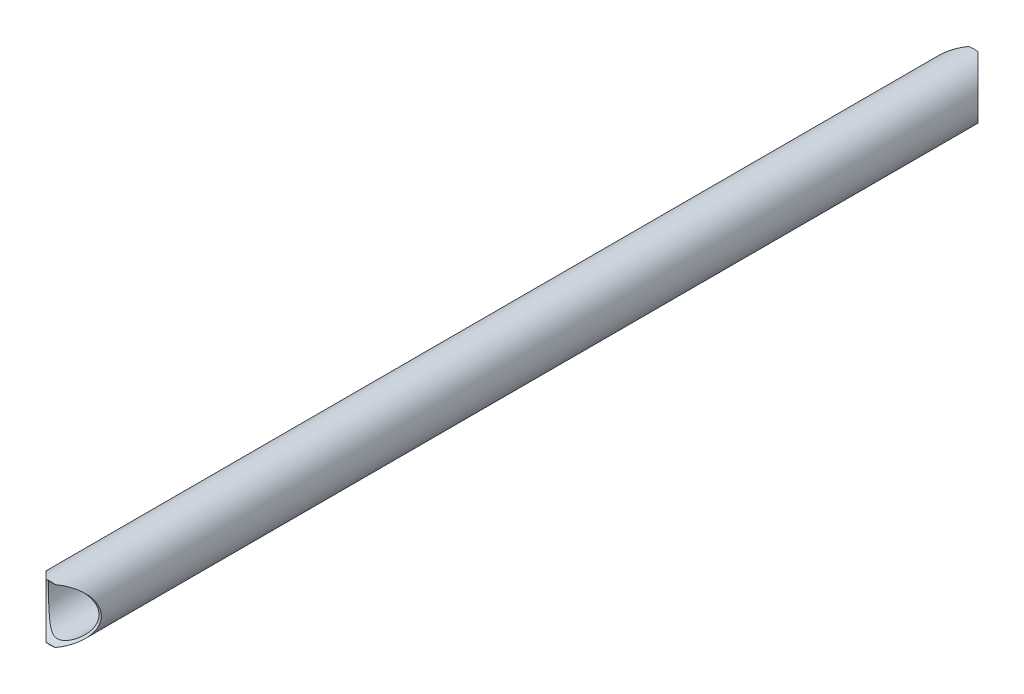
ISO-10303-21;
HEADER;
FILE_DESCRIPTION(('STEP AP214'),'2;1');
FILE_NAME('part.step','',(''),(''),'','','');
FILE_SCHEMA(('AUTOMOTIVE_DESIGN { 1 0 10303 214 1 1 1 1 }'));
ENDSEC;
DATA;
#1=APPLICATION_CONTEXT('core data for automotive mechanical design processes');
#2=APPLICATION_PROTOCOL_DEFINITION('international standard','automotive_design',2000,#1);
#3=PRODUCT_CONTEXT('',#1,'mechanical');
#4=PRODUCT('Part','Part','',(#3));
#5=PRODUCT_RELATED_PRODUCT_CATEGORY('part','',(#4));
#6=PRODUCT_DEFINITION_FORMATION('','',#4);
#7=PRODUCT_DEFINITION_CONTEXT('part definition',#1,'design');
#8=PRODUCT_DEFINITION('design','',#6,#7);
#9=PRODUCT_DEFINITION_SHAPE('','',#8);
#10=(LENGTH_UNIT() NAMED_UNIT(*) SI_UNIT(.MILLI.,.METRE.));
#11=(NAMED_UNIT(*) PLANE_ANGLE_UNIT() SI_UNIT($,.RADIAN.));
#12=(NAMED_UNIT(*) SI_UNIT($,.STERADIAN.) SOLID_ANGLE_UNIT());
#13=UNCERTAINTY_MEASURE_WITH_UNIT(LENGTH_MEASURE(1.E-05),#10,'distance_accuracy_value','');
#14=(GEOMETRIC_REPRESENTATION_CONTEXT(3) GLOBAL_UNCERTAINTY_ASSIGNED_CONTEXT((#13)) GLOBAL_UNIT_ASSIGNED_CONTEXT((#10,
#11,#12)) REPRESENTATION_CONTEXT('',''));
#15=CARTESIAN_POINT('',(0.,0.,0.));
#16=DIRECTION('',(0.,0.,1.));
#17=DIRECTION('',(1.,0.,0.));
#18=AXIS2_PLACEMENT_3D('',#15,#16,#17);
#19=CARTESIAN_POINT('',(-19.05,0.,320.675));
#20=DIRECTION('',(1.,0.,0.));
#21=DIRECTION('',(0.,1.,0.));
#22=AXIS2_PLACEMENT_3D('',#19,#20,#21);
#23=CYLINDRICAL_SURFACE('',#22,19.05);
#24=CARTESIAN_POINT('',(0.,0.,320.675));
#25=DIRECTION('',(-0.707106781186547,0.,-0.707106781186547));
#26=DIRECTION('',(0.707106781186547,0.,-0.707106781186547));
#27=AXIS2_PLACEMENT_3D('',#24,#25,#26);
#28=ELLIPSE('',#27,26.9407683632075,19.05);
#29=CARTESIAN_POINT('',(3.17500000000027,18.7835533113412,317.5));
#30=VERTEX_POINT('',#29);
#31=CARTESIAN_POINT('',(3.17499999999992,-18.7835533113413,317.5));
#32=VERTEX_POINT('',#31);
#33=EDGE_CURVE('E38',#30,#32,#28,.T.);
#34=ORIENTED_EDGE('',*,*,#33,.F.);
#35=DIRECTION('',(1.,0.,0.));
#36=VECTOR('',#35,1.);
#37=CARTESIAN_POINT('',(-19.05,18.7835533113412,317.5));
#38=LINE('',#37,#36);
#39=CARTESIAN_POINT('',(-3.17500000000027,18.7835533113412,317.5));
#40=VERTEX_POINT('',#39);
#41=EDGE_CURVE('E10',#30,#40,#38,.F.);
#42=ORIENTED_EDGE('',*,*,#41,.T.);
#43=CARTESIAN_POINT('',(0.,0.,320.675));
#44=DIRECTION('',(0.707106781186547,0.,-0.707106781186547));
#45=DIRECTION('',(-0.707106781186547,0.,-0.707106781186547));
#46=AXIS2_PLACEMENT_3D('',#43,#44,#45);
#47=ELLIPSE('',#46,26.9407683632075,19.05);
#48=CARTESIAN_POINT('',(-3.17499999999992,-18.7835533113413,317.5));
#49=VERTEX_POINT('',#48);
#50=EDGE_CURVE('E90',#49,#40,#47,.T.);
#51=ORIENTED_EDGE('',*,*,#50,.F.);
#52=DIRECTION('',(1.,0.,0.));
#53=VECTOR('',#52,1.);
#54=CARTESIAN_POINT('',(-19.05,-18.7835533113413,317.5));
#55=LINE('',#54,#53);
#56=EDGE_CURVE('E30',#49,#32,#55,.T.);
#57=ORIENTED_EDGE('',*,*,#56,.T.);
#58=EDGE_LOOP('',(#34,#42,#51,#57));
#59=FACE_BOUND('',#58,.T.);
#60=CARTESIAN_POINT('',(17.399,0.,301.625));
#61=CARTESIAN_POINT('',(17.3989972637382,-0.401295477984503,301.625002701248));
#62=CARTESIAN_POINT('',(17.3850899575458,-0.802632767990221,301.637707080443));
#63=CARTESIAN_POINT('',(17.3297391071603,-1.60183121099222,301.688240623773));
#64=CARTESIAN_POINT('',(17.2882916644051,-1.99969186375831,301.726073345058));
#65=CARTESIAN_POINT('',(17.178656626257,-2.78886528874722,301.826046813985));
#66=CARTESIAN_POINT('',(17.110451424828,-3.18017357253039,301.888203566256));
#67=CARTESIAN_POINT('',(16.9485880673674,-3.95303278006495,302.035503976022));
#68=CARTESIAN_POINT('',(16.8549302041324,-4.33458381600433,302.120647369089));
#69=CARTESIAN_POINT('',(16.6444558992286,-5.08305605708649,302.311632424915));
#70=CARTESIAN_POINT('',(16.5277936695605,-5.45005612613705,302.417336198326));
#71=CARTESIAN_POINT('',(16.2726933574343,-6.17013555865848,302.647940498223));
#72=CARTESIAN_POINT('',(16.134255675443,-6.52321517798751,302.772840671673));
#73=CARTESIAN_POINT('',(15.837389979888,-7.21413093026866,303.039920803895));
#74=CARTESIAN_POINT('',(15.678958985095,-7.55196477968367,303.182103339547));
#75=CARTESIAN_POINT('',(15.3438713660465,-8.2114359013271,303.481801478121));
#76=CARTESIAN_POINT('',(15.1672106171196,-8.53306948347153,303.639320550638));
#77=CARTESIAN_POINT('',(14.7232674090559,-9.28493575660449,304.033555305363));
#78=CARTESIAN_POINT('',(14.4480160824563,-9.70710539157039,304.276733564436));
#79=CARTESIAN_POINT('',(13.869048039859,-10.5177477259465,304.784486395236));
#80=CARTESIAN_POINT('',(13.565320816571,-10.9062078843183,305.0490688599));
#81=CARTESIAN_POINT('',(12.9320986728774,-11.6501119710639,305.595517360938));
#82=CARTESIAN_POINT('',(12.6025521651888,-12.0054865273236,305.877417743096));
#83=CARTESIAN_POINT('',(11.9208031163851,-12.6826857364728,306.453551427335));
#84=CARTESIAN_POINT('',(11.5686034526533,-13.0045146367459,306.747783161451));
#85=CARTESIAN_POINT('',(10.8344071773254,-13.6226529108423,307.351454438697));
#86=CARTESIAN_POINT('',(10.4518967336267,-13.9181594242172,307.661089620099));
#87=CARTESIAN_POINT('',(9.66550523059681,-14.4753423367401,308.283811329452));
#88=CARTESIAN_POINT('',(9.26161904507632,-14.7370105687342,308.596898670896));
#89=CARTESIAN_POINT('',(8.4328662580154,-15.226400353901,309.220060569678));
#90=CARTESIAN_POINT('',(8.00803949509313,-15.454183288145,309.530139599546));
#91=CARTESIAN_POINT('',(7.35336707132236,-15.7705990288144,309.987382291738));
#92=CARTESIAN_POINT('',(7.13227305295607,-15.8718474735204,310.138461148031));
#93=CARTESIAN_POINT('',(6.68382149463942,-16.0658471121592,310.436706372003));
#94=CARTESIAN_POINT('',(6.45646472528382,-16.1585993454799,310.583873216693));
#95=CARTESIAN_POINT('',(5.99922041560824,-16.3338110393034,310.870064937972));
#96=CARTESIAN_POINT('',(5.76945627318041,-16.4164283948192,311.009189766358));
#97=CARTESIAN_POINT('',(5.30288041036134,-16.5730269563605,311.280226935764));
#98=CARTESIAN_POINT('',(5.06607005042598,-16.6470098160954,311.4121406553));
#99=CARTESIAN_POINT('',(4.58466839086435,-16.785968686058,311.666407610603));
#100=CARTESIAN_POINT('',(4.34007592514624,-16.8509433385821,311.788759404));
#101=CARTESIAN_POINT('',(3.84274065668843,-16.9712729810074,312.020782128037));
#102=CARTESIAN_POINT('',(3.58999888903799,-17.0266291869405,312.13045466109));
#103=CARTESIAN_POINT('',(2.90505246494307,-17.1602817410485,312.400784537975));
#104=CARTESIAN_POINT('',(2.46490900989023,-17.2294715038076,312.547067929093));
#105=CARTESIAN_POINT('',(1.79005263644762,-17.3081528356867,312.71671698946));
#106=CARTESIAN_POINT('',(1.56293361527498,-17.3301849394945,312.764943326347));
#107=CARTESIAN_POINT('',(1.10475750135388,-17.3654088459161,312.842573644779));
#108=CARTESIAN_POINT('',(0.873700794529618,-17.378601509813,312.871979460115));
#109=CARTESIAN_POINT('',(0.407238503850324,-17.3958144257975,312.910426096306));
#110=CARTESIAN_POINT('',(0.171812501272492,-17.3997430488713,312.919263467224));
#111=CARTESIAN_POINT('',(-0.298823332550326,-17.3980251590004,312.915410956066));
#112=CARTESIAN_POINT('',(-0.534033165848992,-17.3923787379826,312.902721280663));
#113=CARTESIAN_POINT('',(-1.00239096479141,-17.3716861155403,312.856582942652));
#114=CARTESIAN_POINT('',(-1.23553434141883,-17.3566226413099,312.823096134581));
#115=CARTESIAN_POINT('',(-1.69754111223164,-17.3175445787324,312.737282982415));
#116=CARTESIAN_POINT('',(-1.92640360165006,-17.2935281201242,312.684952702033));
#117=CARTESIAN_POINT('',(-2.44901999823298,-17.2283705808462,312.545217014727));
#118=CARTESIAN_POINT('',(-2.74082875856405,-17.1842269052584,312.451964988895));
#119=CARTESIAN_POINT('',(-3.31413220550718,-17.0829330564108,312.243553687738));
#120=CARTESIAN_POINT('',(-3.59562200390613,-17.0257768090685,312.128384185782));
#121=CARTESIAN_POINT('',(-4.14927470548216,-16.8993964367356,311.881125036109));
#122=CARTESIAN_POINT('',(-4.42140547374324,-16.8301349050272,311.748983287982));
#123=CARTESIAN_POINT('',(-4.95622640328321,-16.6804727351764,311.472332930567));
#124=CARTESIAN_POINT('',(-5.21891246879396,-16.6000673360697,311.327819045705));
#125=CARTESIAN_POINT('',(-5.73166832235644,-16.4300038333165,311.032067609751));
#126=CARTESIAN_POINT('',(-5.98186862535174,-16.3405035401112,310.88096431014));
#127=CARTESIAN_POINT('',(-6.47450872253533,-16.1516411624736,310.572540203637));
#128=CARTESIAN_POINT('',(-6.7169496874412,-16.0522805751134,310.415220342772));
#129=CARTESIAN_POINT('',(-7.19491232211282,-15.8438147888671,310.096135254256));
#130=CARTESIAN_POINT('',(-7.43042833895094,-15.7347019073105,309.934366592625));
#131=CARTESIAN_POINT('',(-7.89480502896909,-15.5069053851449,309.608020658585));
#132=CARTESIAN_POINT('',(-8.12366495844912,-15.3882206806013,309.443443075566));
#133=CARTESIAN_POINT('',(-8.80137125156712,-15.0175471096,308.946987525092));
#134=CARTESIAN_POINT('',(-9.24076727341732,-14.7511914025384,308.61277953889));
#135=CARTESIAN_POINT('',(-10.0951353720985,-14.1801700068193,307.94636878471));
#136=CARTESIAN_POINT('',(-10.5101151582842,-13.8755165069111,307.614165413835));
#137=CARTESIAN_POINT('',(-11.3429584257905,-13.2048311270682,306.93535388567));
#138=CARTESIAN_POINT('',(-11.7590682813179,-12.8360228961387,306.589320070563));
#139=CARTESIAN_POINT('',(-12.5607248970245,-12.052698722243,305.913469728379));
#140=CARTESIAN_POINT('',(-12.9462628233913,-11.6381696502894,305.583657899049));
#141=CARTESIAN_POINT('',(-13.6816202767154,-10.7639876204656,304.948273476111));
#142=CARTESIAN_POINT('',(-14.0315468917035,-10.3044786247362,304.642628866403));
#143=CARTESIAN_POINT('',(-14.526249846972,-9.58115590788083,304.20736049272));
#144=CARTESIAN_POINT('',(-14.6860865147969,-9.33443220655046,304.066167143789));
#145=CARTESIAN_POINT('',(-14.995019216579,-8.82961928430966,303.792382701999));
#146=CARTESIAN_POINT('',(-15.1441130171221,-8.57152771791701,303.659793398467));
#147=CARTESIAN_POINT('',(-15.46765341721,-7.97617772813552,303.371273641479));
#148=CARTESIAN_POINT('',(-15.6387030256946,-7.6356882500325,303.218158847452));
#149=CARTESIAN_POINT('',(-15.9603997252317,-6.9381756632432,302.929391086361));
#150=CARTESIAN_POINT('',(-16.1110530829717,-6.58115767833976,302.793732756487));
#151=CARTESIAN_POINT('',(-16.3899122170257,-5.85218695501575,302.54207640953));
#152=CARTESIAN_POINT('',(-16.5181417196303,-5.48025052030166,302.426057616405));
#153=CARTESIAN_POINT('',(-16.7503954683688,-4.72294688996841,302.215567826417));
#154=CARTESIAN_POINT('',(-16.8544229930462,-4.33758152165401,302.12109391099));
#155=CARTESIAN_POINT('',(-17.019696834772,-3.62798609045296,301.970817854941));
#156=CARTESIAN_POINT('',(-17.0852949692311,-3.30559095195943,301.911096854446));
#157=CARTESIAN_POINT('',(-17.1983931013157,-2.65507480714684,301.808058566684));
#158=CARTESIAN_POINT('',(-17.2458956562491,-2.32695461676436,301.76473896154));
#159=CARTESIAN_POINT('',(-17.3221716737546,-1.66673103302197,301.69515052222));
#160=CARTESIAN_POINT('',(-17.350944578959,-1.33462752142356,301.668882195465));
#161=CARTESIAN_POINT('',(-17.3893612374532,-0.668359196267197,301.633804571953));
#162=CARTESIAN_POINT('',(-17.3990022787262,-0.334194097204855,301.624997750433));
#163=CARTESIAN_POINT('',(-17.3989972637382,0.401295477984504,301.625002701248));
#164=CARTESIAN_POINT('',(-17.3850899575458,0.802632767990227,301.637707080443));
#165=CARTESIAN_POINT('',(-17.3297391071603,1.60183121099223,301.688240623773));
#166=CARTESIAN_POINT('',(-17.2882916644051,1.99969186375833,301.726073345058));
#167=CARTESIAN_POINT('',(-17.178656626257,2.78886528874724,301.826046813985));
#168=CARTESIAN_POINT('',(-17.110451424828,3.1801735725304,301.888203566256));
#169=CARTESIAN_POINT('',(-16.9485880673673,3.95303278006496,302.035503976022));
#170=CARTESIAN_POINT('',(-16.8549302041323,4.33458381600434,302.120647369089));
#171=CARTESIAN_POINT('',(-16.6444558992286,5.08305605708648,302.311632424915));
#172=CARTESIAN_POINT('',(-16.5277936695605,5.45005612613704,302.417336198326));
#173=CARTESIAN_POINT('',(-16.2726933574343,6.17013555865848,302.647940498223));
#174=CARTESIAN_POINT('',(-16.1342556754431,6.52321517798753,302.772840671673));
#175=CARTESIAN_POINT('',(-15.837389979888,7.21413093026867,303.039920803895));
#176=CARTESIAN_POINT('',(-15.678958985095,7.55196477968367,303.182103339547));
#177=CARTESIAN_POINT('',(-15.3438713660465,8.21143590132709,303.481801478121));
#178=CARTESIAN_POINT('',(-15.1672106171196,8.53306948347152,303.639320550638));
#179=CARTESIAN_POINT('',(-14.7232674090559,9.28493575660448,304.033555305363));
#180=CARTESIAN_POINT('',(-14.4480160824563,9.70710539157037,304.276733564436));
#181=CARTESIAN_POINT('',(-13.8690480398591,10.5177477259465,304.784486395236));
#182=CARTESIAN_POINT('',(-13.565320816571,10.9062078843183,305.0490688599));
#183=CARTESIAN_POINT('',(-12.9320986728774,11.6501119710639,305.595517360939));
#184=CARTESIAN_POINT('',(-12.6025521651888,12.0054865273236,305.877417743096));
#185=CARTESIAN_POINT('',(-11.9208031163851,12.6826857364728,306.453551427335));
#186=CARTESIAN_POINT('',(-11.5686034526533,13.0045146367459,306.747783161452));
#187=CARTESIAN_POINT('',(-10.8344071773253,13.6226529108423,307.351454438697));
#188=CARTESIAN_POINT('',(-10.4518967336267,13.9181594242172,307.661089620099));
#189=CARTESIAN_POINT('',(-9.6655052305968,14.4753423367401,308.283811329452));
#190=CARTESIAN_POINT('',(-9.2616190450763,14.7370105687342,308.596898670896));
#191=CARTESIAN_POINT('',(-8.43286625801538,15.2264003539011,309.220060569679));
#192=CARTESIAN_POINT('',(-8.00803949509312,15.454183288145,309.530139599546));
#193=CARTESIAN_POINT('',(-7.35336707132233,15.7705990288144,309.987382291739));
#194=CARTESIAN_POINT('',(-7.13227305295604,15.8718474735204,310.138461148031));
#195=CARTESIAN_POINT('',(-6.68382149463941,16.0658471121592,310.436706372003));
#196=CARTESIAN_POINT('',(-6.45646472528382,16.1585993454799,310.583873216693));
#197=CARTESIAN_POINT('',(-5.99922041560824,16.3338110393034,310.870064937972));
#198=CARTESIAN_POINT('',(-5.76945627318041,16.4164283948192,311.009189766358));
#199=CARTESIAN_POINT('',(-5.30288041036134,16.5730269563605,311.280226935764));
#200=CARTESIAN_POINT('',(-5.06607005042598,16.6470098160954,311.4121406553));
#201=CARTESIAN_POINT('',(-4.58466839086437,16.785968686058,311.666407610603));
#202=CARTESIAN_POINT('',(-4.34007592514626,16.8509433385821,311.788759404));
#203=CARTESIAN_POINT('',(-3.84274065668847,16.9712729810074,312.020782128037));
#204=CARTESIAN_POINT('',(-3.58999888903805,17.0266291869405,312.130454661091));
#205=CARTESIAN_POINT('',(-2.90505246494314,17.1602817410485,312.400784537976));
#206=CARTESIAN_POINT('',(-2.4649090098903,17.2294715038076,312.547067929093));
#207=CARTESIAN_POINT('',(-1.79005263644769,17.3081528356867,312.71671698946));
#208=CARTESIAN_POINT('',(-1.56293361527505,17.3301849394945,312.764943326347));
#209=CARTESIAN_POINT('',(-1.10475750135396,17.365408845916,312.842573644779));
#210=CARTESIAN_POINT('',(-0.873700794529701,17.3786015098129,312.871979460115));
#211=CARTESIAN_POINT('',(-0.407238503850411,17.3958144257975,312.910426096306));
#212=CARTESIAN_POINT('',(-0.171812501272578,17.3997430488713,312.919263467225));
#213=CARTESIAN_POINT('',(0.298823332550242,17.3980251590004,312.915410956066));
#214=CARTESIAN_POINT('',(0.534033165848907,17.3923787379826,312.902721280663));
#215=CARTESIAN_POINT('',(1.00239096479132,17.3716861155403,312.856582942652));
#216=CARTESIAN_POINT('',(1.23553434141874,17.3566226413099,312.823096134582));
#217=CARTESIAN_POINT('',(1.69754111223154,17.3175445787324,312.737282982416));
#218=CARTESIAN_POINT('',(1.92640360164997,17.2935281201243,312.684952702033));
#219=CARTESIAN_POINT('',(2.44901999823287,17.2283705808462,312.545217014727));
#220=CARTESIAN_POINT('',(2.74082875856393,17.1842269052584,312.451964988896));
#221=CARTESIAN_POINT('',(3.31413220550704,17.0829330564108,312.243553687739));
#222=CARTESIAN_POINT('',(3.59562200390599,17.0257768090686,312.128384185782));
#223=CARTESIAN_POINT('',(4.14927470548199,16.8993964367356,311.881125036109));
#224=CARTESIAN_POINT('',(4.42140547374305,16.8301349050273,311.748983287983));
#225=CARTESIAN_POINT('',(4.956226403283,16.6804727351765,311.472332930567));
#226=CARTESIAN_POINT('',(5.21891246879375,16.6000673360698,311.327819045705));
#227=CARTESIAN_POINT('',(5.73166832235623,16.4300038333165,311.032067609751));
#228=CARTESIAN_POINT('',(5.98186862535152,16.3405035401112,310.88096431014));
#229=CARTESIAN_POINT('',(6.4745087225351,16.1516411624737,310.572540203637));
#230=CARTESIAN_POINT('',(6.71694968744097,16.0522805751135,310.415220342772));
#231=CARTESIAN_POINT('',(7.19491232211258,15.8438147888672,310.096135254257));
#232=CARTESIAN_POINT('',(7.43042833895071,15.7347019073106,309.934366592625));
#233=CARTESIAN_POINT('',(7.89480502896885,15.506905385145,309.608020658586));
#234=CARTESIAN_POINT('',(8.12366495844887,15.3882206806015,309.443443075566));
#235=CARTESIAN_POINT('',(8.80137125156687,15.0175471096001,308.946987525092));
#236=CARTESIAN_POINT('',(9.24076727341707,14.7511914025386,308.612779538891));
#237=CARTESIAN_POINT('',(10.0951353720982,14.1801700068195,307.94636878471));
#238=CARTESIAN_POINT('',(10.510115158284,13.8755165069112,307.614165413836));
#239=CARTESIAN_POINT('',(11.3429584257903,13.2048311270684,306.93535388567));
#240=CARTESIAN_POINT('',(11.7590682813177,12.8360228961389,306.589320070564));
#241=CARTESIAN_POINT('',(12.5607248970243,12.0526987222432,305.913469728379));
#242=CARTESIAN_POINT('',(12.9462628233911,11.6381696502896,305.58365789905));
#243=CARTESIAN_POINT('',(13.6816202767152,10.7639876204658,304.948273476111));
#244=CARTESIAN_POINT('',(14.0315468917034,10.3044786247364,304.642628866403));
#245=CARTESIAN_POINT('',(14.5262498469718,9.58115590788108,304.20736049272));
#246=CARTESIAN_POINT('',(14.6860865147968,9.33443220655074,304.066167143789));
#247=CARTESIAN_POINT('',(14.9950192165789,8.82961928430995,303.792382702));
#248=CARTESIAN_POINT('',(15.1441130171219,8.57152771791731,303.659793398467));
#249=CARTESIAN_POINT('',(15.4676534172098,7.97617772813581,303.371273641479));
#250=CARTESIAN_POINT('',(15.6387030256944,7.63568825003279,303.218158847452));
#251=CARTESIAN_POINT('',(15.9603997252315,6.93817566324347,302.929391086361));
#252=CARTESIAN_POINT('',(16.1110530829716,6.58115767834002,302.793732756488));
#253=CARTESIAN_POINT('',(16.3899122170256,5.85218695501601,302.542076409531));
#254=CARTESIAN_POINT('',(16.5181417196302,5.48025052030192,302.426057616406));
#255=CARTESIAN_POINT('',(16.7503954683687,4.72294688996867,302.215567826417));
#256=CARTESIAN_POINT('',(16.8544229930462,4.33758152165426,302.12109391099));
#257=CARTESIAN_POINT('',(17.019696834772,3.62798609045319,301.970817854941));
#258=CARTESIAN_POINT('',(17.0852949692311,3.30559095195963,301.911096854446));
#259=CARTESIAN_POINT('',(17.1983931013157,2.655074807147,301.808058566684));
#260=CARTESIAN_POINT('',(17.2458956562491,2.3269546167645,301.76473896154));
#261=CARTESIAN_POINT('',(17.3221716737546,1.66673103302208,301.69515052222));
#262=CARTESIAN_POINT('',(17.350944578959,1.33462752142365,301.668882195465));
#263=CARTESIAN_POINT('',(17.3893612374532,0.668359196267247,301.633804571953));
#264=CARTESIAN_POINT('',(17.3990022787262,0.33419409720488,301.624997750433));
#265=CARTESIAN_POINT('',(17.399,0.,301.625));
#266=B_SPLINE_CURVE_WITH_KNOTS('',3,(#60,#61,#62,#63,#64,#65,#66,#67,#68,#69,#70,#71,#72,#73,
#74,#75,#76,#77,#78,#79,#80,#81,#82,#83,#84,#85,#86,#87,#88,#89,#90,#91,#92,#93,#94,#95,#96,#97,
#98,#99,#100,#101,#102,#103,#104,#105,#106,#107,#108,#109,#110,#111,#112,#113,#114,#115,#116,
#117,#118,#119,#120,#121,#122,#123,#124,#125,#126,#127,#128,#129,#130,#131,#132,#133,#134,#135,
#136,#137,#138,#139,#140,#141,#142,#143,#144,#145,#146,#147,#148,#149,#150,#151,#152,#153,#154,
#155,#156,#157,#158,#159,#160,#161,#162,#163,#164,#165,#166,#167,#168,#169,#170,#171,#172,#173,
#174,#175,#176,#177,#178,#179,#180,#181,#182,#183,#184,#185,#186,#187,#188,#189,#190,#191,#192,
#193,#194,#195,#196,#197,#198,#199,#200,#201,#202,#203,#204,#205,#206,#207,#208,#209,#210,#211,
#212,#213,#214,#215,#216,#217,#218,#219,#220,#221,#222,#223,#224,#225,#226,#227,#228,#229,#230,
#231,#232,#233,#234,#235,#236,#237,#238,#239,#240,#241,#242,#243,#244,#245,#246,#247,#248,#249,
#250,#251,#252,#253,#254,#255,#256,#257,#258,#259,#260,#261,#262,#263,#264,#265),.UNSPECIFIED.,
.T.,.F.,(4,2,2,2,2,2,2,2,2,2,2,2,2,2,2,2,2,2,2,2,2,2,2,2,2,2,2,2,2,2,2,2,2,2,2,2,2,2,2,2,2,2,2,
2,2,2,2,2,2,2,2,2,2,2,2,2,2,2,2,2,2,2,2,2,2,2,2,2,2,2,2,2,2,2,2,2,2,2,2,2,2,2,2,2,2,2,2,2,2,2,2,
2,2,2,2,2,2,2,2,2,2,2,4),(0.,1.20352183479523,2.40721407559261,3.61169965221531,
4.81617137353511,6.01282765726188,7.20946193615699,8.40627485807016,9.60335916757604,
11.2796096751737,12.9564811533636,14.6367929477549,16.3168917303511,18.0375184928737,
19.7585597711206,21.4764445032523,22.3351215943694,23.1936934981455,24.0364788854438,
24.8791025936676,25.7218531631278,26.5644971084685,27.9655304715347,28.6644193242187,
29.363240069783,30.0689442569093,30.7746416688364,31.4816372875986,32.1887806792162,
33.1157595380662,34.0431719877988,34.9735026211136,35.9042319493349,36.8209262814237,
37.7374816456711,38.6547655282956,39.5721515104627,41.4091442835866,43.2455538840752,
45.207892554975,47.170796196394,49.1276109485616,50.1055704310335,51.0837326455933,
52.3145209545405,53.5449302450508,54.7740296784188,56.0029625136041,57.0052109973988,
58.0073177886008,59.0094543997174,60.0117330574929,61.2152548922882,62.4189471330856,
63.6234327097083,64.8279044310281,66.0245607147548,67.22119499365,68.4180079155631,
69.615092225069,71.2913427326666,72.9682142108566,74.6485260052479,76.328624787844,
78.0492515503667,79.7702928286136,81.4881775607454,82.3468546518625,83.2054265556385,
84.0482119429368,84.8908356511606,85.7335862206208,86.5762301659615,87.9772635290278,
88.6761523817117,89.374973127276,90.0806773144023,90.7863747263294,91.4933703450916,
92.2005137367092,93.1274925955592,94.0549050452918,94.9852356786065,95.9159650068278,
96.8326593389165,97.7492147031639,98.6664985857885,99.5838845679555,101.420877341079,
103.257286941568,105.219625612468,107.182529253887,109.139344006055,110.117303488526,
111.095465703086,112.326254012033,113.556663302544,114.785762735912,116.014695571097,
117.016944054892,118.019050846094,119.02118745721,120.023466114986),.UNSPECIFIED.);
#267=CARTESIAN_POINT('',(17.399,0.,301.625));
#268=VERTEX_POINT('',#267);
#269=EDGE_CURVE('E92',#268,#268,#266,.T.);
#270=ORIENTED_EDGE('',*,*,#269,.T.);
#271=EDGE_LOOP('',(#270));
#272=FACE_BOUND('',#271,.T.);
#273=ADVANCED_FACE('F16',(#59,#272),#23,.F.);
#274=CARTESIAN_POINT('',(0.,0.,320.675));
#275=DIRECTION('',(0.,0.,-1.));
#276=DIRECTION('',(0.,-1.,0.));
#277=AXIS2_PLACEMENT_3D('',#274,#275,#276);
#278=CYLINDRICAL_SURFACE('',#277,17.399);
#279=ORIENTED_EDGE('',*,*,#269,.F.);
#280=EDGE_LOOP('',(#279));
#281=FACE_BOUND('',#280,.T.);
#282=CARTESIAN_POINT('',(17.399,0.,-301.625));
#283=CARTESIAN_POINT('',(17.3989972637382,0.401295477984506,-301.625002701248));
#284=CARTESIAN_POINT('',(17.3850899575458,0.802632767990226,-301.637707080443));
#285=CARTESIAN_POINT('',(17.3297391071603,1.60183121099222,-301.688240623773));
#286=CARTESIAN_POINT('',(17.2882916644051,1.99969186375831,-301.726073345058));
#287=CARTESIAN_POINT('',(17.178656626257,2.78886528874723,-301.826046813985));
#288=CARTESIAN_POINT('',(17.110451424828,3.1801735725304,-301.888203566256));
#289=CARTESIAN_POINT('',(16.9485880673673,3.95303278006496,-302.035503976022));
#290=CARTESIAN_POINT('',(16.8549302041324,4.33458381600434,-302.120647369089));
#291=CARTESIAN_POINT('',(16.6444558992286,5.08305605708649,-302.311632424915));
#292=CARTESIAN_POINT('',(16.5277936695605,5.45005612613705,-302.417336198326));
#293=CARTESIAN_POINT('',(16.2726933574343,6.17013555865848,-302.647940498223));
#294=CARTESIAN_POINT('',(16.134255675443,6.52321517798752,-302.772840671673));
#295=CARTESIAN_POINT('',(15.837389979888,7.21413093026867,-303.039920803895));
#296=CARTESIAN_POINT('',(15.678958985095,7.55196477968367,-303.182103339547));
#297=CARTESIAN_POINT('',(15.3438713660465,8.21143590132711,-303.481801478121));
#298=CARTESIAN_POINT('',(15.1672106171196,8.53306948347153,-303.639320550638));
#299=CARTESIAN_POINT('',(14.7232674090559,9.2849357566045,-304.033555305363));
#300=CARTESIAN_POINT('',(14.4480160824562,9.70710539157042,-304.276733564436));
#301=CARTESIAN_POINT('',(13.869048039859,10.5177477259465,-304.784486395236));
#302=CARTESIAN_POINT('',(13.565320816571,10.9062078843184,-305.0490688599));
#303=CARTESIAN_POINT('',(12.9320986728774,11.6501119710639,-305.595517360938));
#304=CARTESIAN_POINT('',(12.6025521651888,12.0054865273236,-305.877417743096));
#305=CARTESIAN_POINT('',(11.9208031163851,12.6826857364728,-306.453551427335));
#306=CARTESIAN_POINT('',(11.5686034526533,13.0045146367459,-306.747783161451));
#307=CARTESIAN_POINT('',(10.8344071773254,13.6226529108422,-307.351454438697));
#308=CARTESIAN_POINT('',(10.4518967336267,13.9181594242171,-307.661089620099));
#309=CARTESIAN_POINT('',(9.66550523059685,14.4753423367401,-308.283811329452));
#310=CARTESIAN_POINT('',(9.26161904507637,14.7370105687341,-308.596898670896));
#311=CARTESIAN_POINT('',(8.43286625801544,15.226400353901,-309.220060569678));
#312=CARTESIAN_POINT('',(8.00803949509315,15.454183288145,-309.530139599546));
#313=CARTESIAN_POINT('',(7.35336707132236,15.7705990288144,-309.987382291738));
#314=CARTESIAN_POINT('',(7.13227305295606,15.8718474735204,-310.138461148031));
#315=CARTESIAN_POINT('',(6.68382149463941,16.0658471121592,-310.436706372003));
#316=CARTESIAN_POINT('',(6.45646472528381,16.1585993454799,-310.583873216693));
#317=CARTESIAN_POINT('',(5.99922041560823,16.3338110393034,-310.870064937972));
#318=CARTESIAN_POINT('',(5.76945627318039,16.4164283948192,-311.009189766358));
#319=CARTESIAN_POINT('',(5.30288041036133,16.5730269563605,-311.280226935764));
#320=CARTESIAN_POINT('',(5.06607005042596,16.6470098160954,-311.4121406553));
#321=CARTESIAN_POINT('',(4.58466839086433,16.785968686058,-311.666407610603));
#322=CARTESIAN_POINT('',(4.34007592514621,16.8509433385821,-311.788759404));
#323=CARTESIAN_POINT('',(3.8427406566884,16.9712729810074,-312.020782128037));
#324=CARTESIAN_POINT('',(3.58999888903797,17.0266291869405,-312.13045466109));
#325=CARTESIAN_POINT('',(2.90505246494305,17.1602817410485,-312.400784537975));
#326=CARTESIAN_POINT('',(2.46490900989022,17.2294715038076,-312.547067929093));
#327=CARTESIAN_POINT('',(1.79005263644761,17.3081528356867,-312.71671698946));
#328=CARTESIAN_POINT('',(1.56293361527496,17.3301849394945,-312.764943326347));
#329=CARTESIAN_POINT('',(1.10475750135386,17.3654088459161,-312.842573644779));
#330=CARTESIAN_POINT('',(0.873700794529599,17.378601509813,-312.871979460115));
#331=CARTESIAN_POINT('',(0.407238503850309,17.3958144257975,-312.910426096306));
#332=CARTESIAN_POINT('',(0.171812501272478,17.3997430488713,-312.919263467224));
#333=CARTESIAN_POINT('',(-0.298823332550339,17.3980251590004,-312.915410956066));
#334=CARTESIAN_POINT('',(-0.534033165849005,17.3923787379826,-312.902721280663));
#335=CARTESIAN_POINT('',(-1.00239096479142,17.3716861155403,-312.856582942652));
#336=CARTESIAN_POINT('',(-1.23553434141885,17.3566226413099,-312.823096134581));
#337=CARTESIAN_POINT('',(-1.69754111223165,17.3175445787324,-312.737282982415));
#338=CARTESIAN_POINT('',(-1.92640360165008,17.2935281201242,-312.684952702033));
#339=CARTESIAN_POINT('',(-2.449019998233,17.2283705808462,-312.545217014727));
#340=CARTESIAN_POINT('',(-2.74082875856408,17.1842269052584,-312.451964988895));
#341=CARTESIAN_POINT('',(-3.31413220550723,17.0829330564108,-312.243553687738));
#342=CARTESIAN_POINT('',(-3.59562200390618,17.0257768090685,-312.128384185782));
#343=CARTESIAN_POINT('',(-4.1492747054822,16.8993964367356,-311.881125036109));
#344=CARTESIAN_POINT('',(-4.42140547374327,16.8301349050272,-311.748983287982));
#345=CARTESIAN_POINT('',(-4.95622640328323,16.6804727351764,-311.472332930567));
#346=CARTESIAN_POINT('',(-5.21891246879397,16.6000673360697,-311.327819045705));
#347=CARTESIAN_POINT('',(-5.73166832235646,16.4300038333165,-311.032067609751));
#348=CARTESIAN_POINT('',(-5.98186862535176,16.3405035401112,-310.88096431014));
#349=CARTESIAN_POINT('',(-6.47450872253536,16.1516411624736,-310.572540203637));
#350=CARTESIAN_POINT('',(-6.71694968744124,16.0522805751133,-310.415220342772));
#351=CARTESIAN_POINT('',(-7.19491232211284,15.8438147888671,-310.096135254256));
#352=CARTESIAN_POINT('',(-7.43042833895096,15.7347019073105,-309.934366592624));
#353=CARTESIAN_POINT('',(-7.89480502896911,15.5069053851449,-309.608020658585));
#354=CARTESIAN_POINT('',(-8.12366495844914,15.3882206806013,-309.443443075566));
#355=CARTESIAN_POINT('',(-8.80137125156715,15.0175471096,-308.946987525092));
#356=CARTESIAN_POINT('',(-9.24076727341733,14.7511914025384,-308.61277953889));
#357=CARTESIAN_POINT('',(-10.0951353720985,14.1801700068193,-307.94636878471));
#358=CARTESIAN_POINT('',(-10.5101151582842,13.8755165069111,-307.614165413835));
#359=CARTESIAN_POINT('',(-11.3429584257906,13.2048311270682,-306.93535388567));
#360=CARTESIAN_POINT('',(-11.759068281318,12.8360228961386,-306.589320070563));
#361=CARTESIAN_POINT('',(-12.5607248970246,12.052698722243,-305.913469728379));
#362=CARTESIAN_POINT('',(-12.9462628233913,11.6381696502893,-305.583657899049));
#363=CARTESIAN_POINT('',(-13.6816202767154,10.7639876204656,-304.948273476111));
#364=CARTESIAN_POINT('',(-14.0315468917036,10.3044786247362,-304.642628866403));
#365=CARTESIAN_POINT('',(-14.526249846972,9.58115590788081,-304.20736049272));
#366=CARTESIAN_POINT('',(-14.6860865147969,9.33443220655046,-304.066167143788));
#367=CARTESIAN_POINT('',(-14.995019216579,8.82961928430966,-303.792382701999));
#368=CARTESIAN_POINT('',(-15.1441130171221,8.57152771791701,-303.659793398467));
#369=CARTESIAN_POINT('',(-15.46765341721,7.97617772813551,-303.371273641479));
#370=CARTESIAN_POINT('',(-15.6387030256946,7.63568825003249,-303.218158847452));
#371=CARTESIAN_POINT('',(-15.9603997252317,6.93817566324318,-302.929391086361));
#372=CARTESIAN_POINT('',(-16.1110530829717,6.58115767833972,-302.793732756487));
#373=CARTESIAN_POINT('',(-16.3899122170257,5.85218695501571,-302.54207640953));
#374=CARTESIAN_POINT('',(-16.5181417196303,5.48025052030165,-302.426057616406));
#375=CARTESIAN_POINT('',(-16.7503954683688,4.72294688996841,-302.215567826417));
#376=CARTESIAN_POINT('',(-16.8544229930462,4.337581521654,-302.12109391099));
#377=CARTESIAN_POINT('',(-17.019696834772,3.62798609045296,-301.970817854941));
#378=CARTESIAN_POINT('',(-17.0852949692311,3.30559095195943,-301.911096854446));
#379=CARTESIAN_POINT('',(-17.1983931013157,2.65507480714684,-301.808058566684));
#380=CARTESIAN_POINT('',(-17.2458956562491,2.32695461676436,-301.76473896154));
#381=CARTESIAN_POINT('',(-17.3221716737546,1.66673103302198,-301.69515052222));
#382=CARTESIAN_POINT('',(-17.350944578959,1.33462752142357,-301.668882195465));
#383=CARTESIAN_POINT('',(-17.3893612374532,0.668359196267211,-301.633804571953));
#384=CARTESIAN_POINT('',(-17.3990022787262,0.334194097204869,-301.624997750433));
#385=CARTESIAN_POINT('',(-17.3989972637382,-0.401295477984492,-301.625002701248));
#386=CARTESIAN_POINT('',(-17.3850899575458,-0.802632767990214,-301.637707080443));
#387=CARTESIAN_POINT('',(-17.3297391071603,-1.60183121099222,-301.688240623773));
#388=CARTESIAN_POINT('',(-17.2882916644051,-1.99969186375831,-301.726073345058));
#389=CARTESIAN_POINT('',(-17.178656626257,-2.78886528874723,-301.826046813985));
#390=CARTESIAN_POINT('',(-17.110451424828,-3.18017357253039,-301.888203566256));
#391=CARTESIAN_POINT('',(-16.9485880673674,-3.95303278006495,-302.035503976022));
#392=CARTESIAN_POINT('',(-16.8549302041324,-4.33458381600432,-302.120647369089));
#393=CARTESIAN_POINT('',(-16.6444558992286,-5.08305605708648,-302.311632424915));
#394=CARTESIAN_POINT('',(-16.5277936695605,-5.45005612613704,-302.417336198326));
#395=CARTESIAN_POINT('',(-16.2726933574343,-6.17013555865848,-302.647940498223));
#396=CARTESIAN_POINT('',(-16.1342556754431,-6.52321517798752,-302.772840671673));
#397=CARTESIAN_POINT('',(-15.837389979888,-7.21413093026866,-303.039920803895));
#398=CARTESIAN_POINT('',(-15.678958985095,-7.55196477968366,-303.182103339547));
#399=CARTESIAN_POINT('',(-15.3438713660465,-8.21143590132708,-303.481801478121));
#400=CARTESIAN_POINT('',(-15.1672106171196,-8.53306948347151,-303.639320550638));
#401=CARTESIAN_POINT('',(-14.7232674090559,-9.28493575660448,-304.033555305363));
#402=CARTESIAN_POINT('',(-14.4480160824563,-9.70710539157039,-304.276733564436));
#403=CARTESIAN_POINT('',(-13.869048039859,-10.5177477259465,-304.784486395236));
#404=CARTESIAN_POINT('',(-13.565320816571,-10.9062078843183,-305.0490688599));
#405=CARTESIAN_POINT('',(-12.9320986728774,-11.6501119710639,-305.595517360939));
#406=CARTESIAN_POINT('',(-12.6025521651888,-12.0054865273236,-305.877417743096));
#407=CARTESIAN_POINT('',(-11.9208031163851,-12.6826857364728,-306.453551427335));
#408=CARTESIAN_POINT('',(-11.5686034526533,-13.0045146367459,-306.747783161452));
#409=CARTESIAN_POINT('',(-10.8344071773254,-13.6226529108423,-307.351454438697));
#410=CARTESIAN_POINT('',(-10.4518967336267,-13.9181594242172,-307.661089620099));
#411=CARTESIAN_POINT('',(-9.66550523059681,-14.4753423367401,-308.283811329452));
#412=CARTESIAN_POINT('',(-9.26161904507631,-14.7370105687342,-308.596898670896));
#413=CARTESIAN_POINT('',(-8.43286625801539,-15.226400353901,-309.220060569679));
#414=CARTESIAN_POINT('',(-8.00803949509313,-15.454183288145,-309.530139599546));
#415=CARTESIAN_POINT('',(-7.35336707132235,-15.7705990288144,-309.987382291739));
#416=CARTESIAN_POINT('',(-7.13227305295606,-15.8718474735204,-310.138461148031));
#417=CARTESIAN_POINT('',(-6.68382149463943,-16.0658471121592,-310.436706372003));
#418=CARTESIAN_POINT('',(-6.45646472528385,-16.1585993454799,-310.583873216693));
#419=CARTESIAN_POINT('',(-5.99922041560826,-16.3338110393034,-310.870064937972));
#420=CARTESIAN_POINT('',(-5.76945627318042,-16.4164283948192,-311.009189766358));
#421=CARTESIAN_POINT('',(-5.30288041036138,-16.5730269563604,-311.280226935764));
#422=CARTESIAN_POINT('',(-5.06607005042605,-16.6470098160954,-311.4121406553));
#423=CARTESIAN_POINT('',(-4.58466839086446,-16.7859686860579,-311.666407610603));
#424=CARTESIAN_POINT('',(-4.34007592514633,-16.850943338582,-311.788759404));
#425=CARTESIAN_POINT('',(-3.84274065668851,-16.9712729810074,-312.020782128037));
#426=CARTESIAN_POINT('',(-3.58999888903808,-17.0266291869404,-312.130454661091));
#427=CARTESIAN_POINT('',(-2.90505246494317,-17.1602817410485,-312.400784537976));
#428=CARTESIAN_POINT('',(-2.46490900989033,-17.2294715038076,-312.547067929093));
#429=CARTESIAN_POINT('',(-1.79005263644771,-17.3081528356867,-312.71671698946));
#430=CARTESIAN_POINT('',(-1.56293361527507,-17.3301849394945,-312.764943326347));
#431=CARTESIAN_POINT('',(-1.10475750135397,-17.365408845916,-312.842573644779));
#432=CARTESIAN_POINT('',(-0.873700794529715,-17.3786015098129,-312.871979460115));
#433=CARTESIAN_POINT('',(-0.407238503850421,-17.3958144257975,-312.910426096306));
#434=CARTESIAN_POINT('',(-0.171812501272585,-17.3997430488713,-312.919263467225));
#435=CARTESIAN_POINT('',(0.298823332550237,-17.3980251590004,-312.915410956066));
#436=CARTESIAN_POINT('',(0.534033165848902,-17.3923787379826,-312.902721280663));
#437=CARTESIAN_POINT('',(1.00239096479132,-17.3716861155403,-312.856582942652));
#438=CARTESIAN_POINT('',(1.23553434141874,-17.3566226413099,-312.823096134582));
#439=CARTESIAN_POINT('',(1.69754111223155,-17.3175445787324,-312.737282982416));
#440=CARTESIAN_POINT('',(1.92640360164997,-17.2935281201243,-312.684952702033));
#441=CARTESIAN_POINT('',(2.44901999823286,-17.2283705808462,-312.545217014727));
#442=CARTESIAN_POINT('',(2.74082875856392,-17.1842269052584,-312.451964988896));
#443=CARTESIAN_POINT('',(3.31413220550702,-17.0829330564108,-312.243553687739));
#444=CARTESIAN_POINT('',(3.59562200390596,-17.0257768090686,-312.128384185782));
#445=CARTESIAN_POINT('',(4.14927470548198,-16.8993964367356,-311.881125036109));
#446=CARTESIAN_POINT('',(4.42140547374305,-16.8301349050273,-311.748983287983));
#447=CARTESIAN_POINT('',(4.95622640328301,-16.6804727351765,-311.472332930567));
#448=CARTESIAN_POINT('',(5.21891246879375,-16.6000673360698,-311.327819045705));
#449=CARTESIAN_POINT('',(5.73166832235622,-16.4300038333165,-311.032067609751));
#450=CARTESIAN_POINT('',(5.98186862535153,-16.3405035401112,-310.88096431014));
#451=CARTESIAN_POINT('',(6.47450872253511,-16.1516411624737,-310.572540203637));
#452=CARTESIAN_POINT('',(6.71694968744096,-16.0522805751135,-310.415220342772));
#453=CARTESIAN_POINT('',(7.19491232211256,-15.8438147888672,-310.096135254257));
#454=CARTESIAN_POINT('',(7.43042833895069,-15.7347019073106,-309.934366592625));
#455=CARTESIAN_POINT('',(7.89480502896886,-15.506905385145,-309.608020658586));
#456=CARTESIAN_POINT('',(8.12366495844889,-15.3882206806015,-309.443443075566));
#457=CARTESIAN_POINT('',(8.80137125156689,-15.0175471096001,-308.946987525092));
#458=CARTESIAN_POINT('',(9.24076727341707,-14.7511914025386,-308.612779538891));
#459=CARTESIAN_POINT('',(10.0951353720982,-14.1801700068195,-307.946368784711));
#460=CARTESIAN_POINT('',(10.510115158284,-13.8755165069112,-307.614165413836));
#461=CARTESIAN_POINT('',(11.3429584257903,-13.2048311270684,-306.93535388567));
#462=CARTESIAN_POINT('',(11.7590682813177,-12.8360228961389,-306.589320070564));
#463=CARTESIAN_POINT('',(12.5607248970243,-12.0526987222432,-305.913469728379));
#464=CARTESIAN_POINT('',(12.9462628233911,-11.6381696502896,-305.58365789905));
#465=CARTESIAN_POINT('',(13.6816202767152,-10.7639876204658,-304.948273476111));
#466=CARTESIAN_POINT('',(14.0315468917034,-10.3044786247364,-304.642628866403));
#467=CARTESIAN_POINT('',(14.5262498469718,-9.58115590788107,-304.20736049272));
#468=CARTESIAN_POINT('',(14.6860865147968,-9.3344322065507,-304.066167143789));
#469=CARTESIAN_POINT('',(14.9950192165789,-8.82961928430992,-303.792382702));
#470=CARTESIAN_POINT('',(15.1441130171219,-8.57152771791729,-303.659793398467));
#471=CARTESIAN_POINT('',(15.4676534172098,-7.97617772813581,-303.371273641479));
#472=CARTESIAN_POINT('',(15.6387030256944,-7.63568825003278,-303.218158847452));
#473=CARTESIAN_POINT('',(15.9603997252315,-6.93817566324347,-302.929391086361));
#474=CARTESIAN_POINT('',(16.1110530829716,-6.58115767834002,-302.793732756488));
#475=CARTESIAN_POINT('',(16.3899122170256,-5.852186955016,-302.54207640953));
#476=CARTESIAN_POINT('',(16.5181417196302,-5.48025052030192,-302.426057616406));
#477=CARTESIAN_POINT('',(16.7503954683687,-4.72294688996866,-302.215567826417));
#478=CARTESIAN_POINT('',(16.8544229930462,-4.33758152165426,-302.12109391099));
#479=CARTESIAN_POINT('',(17.019696834772,-3.62798609045319,-301.970817854941));
#480=CARTESIAN_POINT('',(17.0852949692311,-3.30559095195963,-301.911096854446));
#481=CARTESIAN_POINT('',(17.1983931013157,-2.655074807147,-301.808058566684));
#482=CARTESIAN_POINT('',(17.2458956562491,-2.3269546167645,-301.76473896154));
#483=CARTESIAN_POINT('',(17.3221716737546,-1.66673103302208,-301.69515052222));
#484=CARTESIAN_POINT('',(17.350944578959,-1.33462752142364,-301.668882195465));
#485=CARTESIAN_POINT('',(17.3893612374532,-0.668359196267241,-301.633804571953));
#486=CARTESIAN_POINT('',(17.3990022787262,-0.334194097204875,-301.624997750433));
#487=CARTESIAN_POINT('',(17.399,0.,-301.625));
#488=B_SPLINE_CURVE_WITH_KNOTS('',3,(#282,#283,#284,#285,#286,#287,#288,#289,#290,#291,#292,
#293,#294,#295,#296,#297,#298,#299,#300,#301,#302,#303,#304,#305,#306,#307,#308,#309,#310,#311,
#312,#313,#314,#315,#316,#317,#318,#319,#320,#321,#322,#323,#324,#325,#326,#327,#328,#329,#330,
#331,#332,#333,#334,#335,#336,#337,#338,#339,#340,#341,#342,#343,#344,#345,#346,#347,#348,#349,
#350,#351,#352,#353,#354,#355,#356,#357,#358,#359,#360,#361,#362,#363,#364,#365,#366,#367,#368,
#369,#370,#371,#372,#373,#374,#375,#376,#377,#378,#379,#380,#381,#382,#383,#384,#385,#386,#387,
#388,#389,#390,#391,#392,#393,#394,#395,#396,#397,#398,#399,#400,#401,#402,#403,#404,#405,#406,
#407,#408,#409,#410,#411,#412,#413,#414,#415,#416,#417,#418,#419,#420,#421,#422,#423,#424,#425,
#426,#427,#428,#429,#430,#431,#432,#433,#434,#435,#436,#437,#438,#439,#440,#441,#442,#443,#444,
#445,#446,#447,#448,#449,#450,#451,#452,#453,#454,#455,#456,#457,#458,#459,#460,#461,#462,#463,
#464,#465,#466,#467,#468,#469,#470,#471,#472,#473,#474,#475,#476,#477,#478,#479,#480,#481,#482,
#483,#484,#485,#486,#487),.UNSPECIFIED.,.T.,.F.,(4,2,2,2,2,2,2,2,2,2,2,2,2,2,2,2,2,2,2,2,2,2,2,
2,2,2,2,2,2,2,2,2,2,2,2,2,2,2,2,2,2,2,2,2,2,2,2,2,2,2,2,2,2,2,2,2,2,2,2,2,2,2,2,2,2,2,2,2,2,2,2,
2,2,2,2,2,2,2,2,2,2,2,2,2,2,2,2,2,2,2,2,2,2,2,2,2,2,2,2,2,2,2,4),(0.,1.20352183479523,
2.4072140755926,3.6116996522153,4.81617137353511,6.01282765726189,7.209461936157,
8.40627485807016,9.60335916757604,11.2796096751737,12.9564811533637,14.6367929477549,
16.3168917303511,18.0375184928736,19.7585597711206,21.4764445032523,22.3351215943694,
23.1936934981455,24.0364788854438,24.8791025936676,25.7218531631279,26.5644971084685,
27.9655304715348,28.6644193242187,29.363240069783,30.0689442569093,30.7746416688364,
31.4816372875986,32.1887806792162,33.1157595380662,34.0431719877989,34.9735026211136,
35.904231949335,36.8209262814237,37.7374816456711,38.6547655282957,39.5721515104627,
41.4091442835867,43.2455538840752,45.2078925549751,47.170796196394,49.1276109485617,
50.1055704310335,51.0837326455933,52.3145209545405,53.5449302450508,54.7740296784188,
56.0029625136041,57.0052109973988,58.0073177886008,59.0094543997173,60.0117330574929,
61.2152548922882,62.4189471330855,63.6234327097082,64.827904431028,66.0245607147548,
67.22119499365,68.4180079155631,69.615092225069,71.2913427326667,72.9682142108566,
74.6485260052479,76.328624787844,78.0492515503667,79.7702928286136,81.4881775607454,
82.3468546518625,83.2054265556385,84.0482119429368,84.8908356511605,85.7335862206208,
86.5762301659615,87.9772635290277,88.6761523817117,89.3749731272759,90.0806773144023,
90.7863747263294,91.4933703450916,92.2005137367092,93.1274925955591,94.0549050452917,
94.9852356786064,95.9159650068278,96.8326593389165,97.7492147031639,98.6664985857885,
99.5838845679555,101.420877341079,103.257286941568,105.219625612468,107.182529253887,
109.139344006055,110.117303488526,111.095465703086,112.326254012033,113.556663302544,
114.785762735912,116.014695571097,117.016944054892,118.019050846094,119.021187457211,
120.023466114986),.UNSPECIFIED.);
#489=CARTESIAN_POINT('',(17.399,0.,-301.625));
#490=VERTEX_POINT('',#489);
#491=EDGE_CURVE('E21',#490,#490,#488,.T.);
#492=ORIENTED_EDGE('',*,*,#491,.F.);
#493=EDGE_LOOP('',(#492));
#494=FACE_BOUND('',#493,.T.);
#495=ADVANCED_FACE('F100',(#281,#494),#278,.F.);
#496=CARTESIAN_POINT('',(0.,0.,320.675));
#497=DIRECTION('',(0.,0.,-1.));
#498=DIRECTION('',(0.,-1.,0.));
#499=AXIS2_PLACEMENT_3D('',#496,#497,#498);
#500=CYLINDRICAL_SURFACE('',#499,19.05);
#501=ORIENTED_EDGE('',*,*,#50,.T.);
#502=CARTESIAN_POINT('',(0.,0.,317.5));
#503=DIRECTION('',(0.,0.,-1.));
#504=DIRECTION('',(-1.,0.,0.));
#505=AXIS2_PLACEMENT_3D('',#502,#503,#504);
#506=CIRCLE('',#505,19.05);
#507=EDGE_CURVE('E87',#40,#30,#506,.T.);
#508=ORIENTED_EDGE('',*,*,#507,.T.);
#509=ORIENTED_EDGE('',*,*,#33,.T.);
#510=CARTESIAN_POINT('',(0.,0.,317.5));
#511=DIRECTION('',(0.,0.,-1.));
#512=DIRECTION('',(-1.,0.,0.));
#513=AXIS2_PLACEMENT_3D('',#510,#511,#512);
#514=CIRCLE('',#513,19.05);
#515=EDGE_CURVE('E75',#32,#49,#514,.T.);
#516=ORIENTED_EDGE('',*,*,#515,.T.);
#517=EDGE_LOOP('',(#501,#508,#509,#516));
#518=FACE_BOUND('',#517,.T.);
#519=CARTESIAN_POINT('',(0.,0.,-320.675));
#520=DIRECTION('',(-0.707106781186547,0.,-0.707106781186547));
#521=DIRECTION('',(0.707106781186547,0.,-0.707106781186547));
#522=AXIS2_PLACEMENT_3D('',#519,#520,#521);
#523=ELLIPSE('',#522,26.9407683632075,19.05);
#524=CARTESIAN_POINT('',(-3.17499999999992,18.7835533113413,-317.5));
#525=VERTEX_POINT('',#524);
#526=CARTESIAN_POINT('',(-3.17500000000029,-18.7835533113412,-317.5));
#527=VERTEX_POINT('',#526);
#528=EDGE_CURVE('E65',#525,#527,#523,.F.);
#529=ORIENTED_EDGE('',*,*,#528,.T.);
#530=CARTESIAN_POINT('',(0.,0.,-317.5));
#531=DIRECTION('',(0.,0.,1.));
#532=DIRECTION('',(1.,0.,0.));
#533=AXIS2_PLACEMENT_3D('',#530,#531,#532);
#534=CIRCLE('',#533,19.05);
#535=CARTESIAN_POINT('',(3.17500000000029,-18.7835533113412,-317.5));
#536=VERTEX_POINT('',#535);
#537=EDGE_CURVE('E76',#527,#536,#534,.T.);
#538=ORIENTED_EDGE('',*,*,#537,.T.);
#539=CARTESIAN_POINT('',(0.,0.,-320.675));
#540=DIRECTION('',(0.707106781186547,0.,-0.707106781186547));
#541=DIRECTION('',(-0.707106781186547,0.,-0.707106781186547));
#542=AXIS2_PLACEMENT_3D('',#539,#540,#541);
#543=ELLIPSE('',#542,26.9407683632075,19.05);
#544=CARTESIAN_POINT('',(3.17499999999992,18.7835533113413,-317.5));
#545=VERTEX_POINT('',#544);
#546=EDGE_CURVE('E67',#536,#545,#543,.F.);
#547=ORIENTED_EDGE('',*,*,#546,.T.);
#548=CARTESIAN_POINT('',(0.,0.,-317.5));
#549=DIRECTION('',(0.,0.,1.));
#550=DIRECTION('',(1.,0.,0.));
#551=AXIS2_PLACEMENT_3D('',#548,#549,#550);
#552=CIRCLE('',#551,19.05);
#553=EDGE_CURVE('E58',#545,#525,#552,.T.);
#554=ORIENTED_EDGE('',*,*,#553,.T.);
#555=EDGE_LOOP('',(#529,#538,#547,#554));
#556=FACE_BOUND('',#555,.T.);
#557=ADVANCED_FACE('F63',(#518,#556),#500,.T.);
#558=CARTESIAN_POINT('',(-19.05,0.,-320.675));
#559=DIRECTION('',(1.,0.,0.));
#560=DIRECTION('',(0.,1.,0.));
#561=AXIS2_PLACEMENT_3D('',#558,#559,#560);
#562=CYLINDRICAL_SURFACE('',#561,19.05);
#563=ORIENTED_EDGE('',*,*,#546,.F.);
#564=DIRECTION('',(1.,0.,0.));
#565=VECTOR('',#564,1.);
#566=CARTESIAN_POINT('',(-19.05,-18.7835533113412,-317.5));
#567=LINE('',#566,#565);
#568=EDGE_CURVE('E69',#536,#527,#567,.F.);
#569=ORIENTED_EDGE('',*,*,#568,.T.);
#570=ORIENTED_EDGE('',*,*,#528,.F.);
#571=DIRECTION('',(1.,0.,0.));
#572=VECTOR('',#571,1.);
#573=CARTESIAN_POINT('',(-19.05,18.7835533113413,-317.5));
#574=LINE('',#573,#572);
#575=EDGE_CURVE('E73',#525,#545,#574,.T.);
#576=ORIENTED_EDGE('',*,*,#575,.T.);
#577=EDGE_LOOP('',(#563,#569,#570,#576));
#578=FACE_BOUND('',#577,.T.);
#579=ORIENTED_EDGE('',*,*,#491,.T.);
#580=EDGE_LOOP('',(#579));
#581=FACE_BOUND('',#580,.T.);
#582=ADVANCED_FACE('F18',(#578,#581),#562,.F.);
#583=CARTESIAN_POINT('',(-19.05,19.05,317.5));
#584=DIRECTION('',(0.,0.,-1.));
#585=DIRECTION('',(-1.,0.,0.));
#586=AXIS2_PLACEMENT_3D('',#583,#584,#585);
#587=PLANE('',#586);
#588=ORIENTED_EDGE('',*,*,#56,.F.);
#589=ORIENTED_EDGE('',*,*,#515,.F.);
#590=EDGE_LOOP('',(#588,#589));
#591=FACE_BOUND('',#590,.T.);
#592=ADVANCED_FACE('F111',(#591),#587,.F.);
#593=CARTESIAN_POINT('',(-19.05,19.05,317.5));
#594=DIRECTION('',(0.,0.,-1.));
#595=DIRECTION('',(-1.,0.,0.));
#596=AXIS2_PLACEMENT_3D('',#593,#594,#595);
#597=PLANE('',#596);
#598=ORIENTED_EDGE('',*,*,#507,.F.);
#599=ORIENTED_EDGE('',*,*,#41,.F.);
#600=EDGE_LOOP('',(#598,#599));
#601=FACE_BOUND('',#600,.T.);
#602=ADVANCED_FACE('F141',(#601),#597,.F.);
#603=CARTESIAN_POINT('',(-19.05,19.05,-317.5));
#604=DIRECTION('',(0.,0.,1.));
#605=DIRECTION('',(1.,0.,0.));
#606=AXIS2_PLACEMENT_3D('',#603,#604,#605);
#607=PLANE('',#606);
#608=ORIENTED_EDGE('',*,*,#575,.F.);
#609=ORIENTED_EDGE('',*,*,#553,.F.);
#610=EDGE_LOOP('',(#608,#609));
#611=FACE_BOUND('',#610,.T.);
#612=ADVANCED_FACE('F78',(#611),#607,.F.);
#613=CARTESIAN_POINT('',(-19.05,19.05,-317.5));
#614=DIRECTION('',(0.,0.,1.));
#615=DIRECTION('',(1.,0.,0.));
#616=AXIS2_PLACEMENT_3D('',#613,#614,#615);
#617=PLANE('',#616);
#618=ORIENTED_EDGE('',*,*,#537,.F.);
#619=ORIENTED_EDGE('',*,*,#568,.F.);
#620=EDGE_LOOP('',(#618,#619));
#621=FACE_BOUND('',#620,.T.);
#622=ADVANCED_FACE('F156',(#621),#617,.F.);
#623=CLOSED_SHELL('',(#273,#495,#557,#582,#592,#602,#612,#622));
#624=MANIFOLD_SOLID_BREP('B1',#623);
#625=ADVANCED_BREP_SHAPE_REPRESENTATION('',(#18,#624),#14);
#626=SHAPE_DEFINITION_REPRESENTATION(#9,#625);
ENDSEC;
END-ISO-10303-21;
